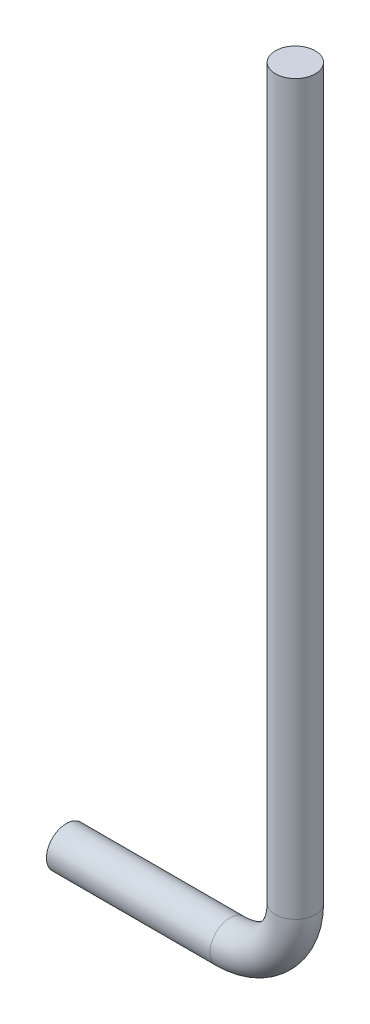
ISO-10303-21;
HEADER;
FILE_DESCRIPTION(('STEP AP214'),'2;1');
FILE_NAME('part.step','',(''),(''),'','','');
FILE_SCHEMA(('AUTOMOTIVE_DESIGN { 1 0 10303 214 1 1 1 1 }'));
ENDSEC;
DATA;
#1=APPLICATION_CONTEXT('core data for automotive mechanical design processes');
#2=APPLICATION_PROTOCOL_DEFINITION('international standard','automotive_design',2000,#1);
#3=PRODUCT_CONTEXT('',#1,'mechanical');
#4=PRODUCT('Part','Part','',(#3));
#5=PRODUCT_RELATED_PRODUCT_CATEGORY('part','',(#4));
#6=PRODUCT_DEFINITION_FORMATION('','',#4);
#7=PRODUCT_DEFINITION_CONTEXT('part definition',#1,'design');
#8=PRODUCT_DEFINITION('design','',#6,#7);
#9=PRODUCT_DEFINITION_SHAPE('','',#8);
#10=(LENGTH_UNIT() NAMED_UNIT(*) SI_UNIT(.MILLI.,.METRE.));
#11=(NAMED_UNIT(*) PLANE_ANGLE_UNIT() SI_UNIT($,.RADIAN.));
#12=(NAMED_UNIT(*) SI_UNIT($,.STERADIAN.) SOLID_ANGLE_UNIT());
#13=UNCERTAINTY_MEASURE_WITH_UNIT(LENGTH_MEASURE(1.E-05),#10,'distance_accuracy_value','');
#14=(GEOMETRIC_REPRESENTATION_CONTEXT(3) GLOBAL_UNCERTAINTY_ASSIGNED_CONTEXT((#13)) GLOBAL_UNIT_ASSIGNED_CONTEXT((#10,
#11,#12)) REPRESENTATION_CONTEXT('',''));
#15=CARTESIAN_POINT('',(0.,0.,0.));
#16=DIRECTION('',(0.,0.,1.));
#17=DIRECTION('',(1.,0.,0.));
#18=AXIS2_PLACEMENT_3D('',#15,#16,#17);
#19=CARTESIAN_POINT('',(25.,-23.,-5.));
#20=DIRECTION('',(-1.,0.,0.));
#21=DIRECTION('',(0.,-1.,0.));
#22=AXIS2_PLACEMENT_3D('',#19,#20,#21);
#23=CYLINDRICAL_SURFACE('',#22,3.05);
#24=CARTESIAN_POINT('',(25.,-23.,-5.));
#25=DIRECTION('',(1.,0.,0.));
#26=DIRECTION('',(0.,0.,1.));
#27=AXIS2_PLACEMENT_3D('',#24,#25,#26);
#28=CIRCLE('',#27,3.05);
#29=CARTESIAN_POINT('',(25.,-26.05,-5.));
#30=VERTEX_POINT('',#29);
#31=EDGE_CURVE('E40',#30,#30,#28,.T.);
#32=ORIENTED_EDGE('',*,*,#31,.F.);
#33=EDGE_LOOP('',(#32));
#34=FACE_BOUND('',#33,.T.);
#35=CARTESIAN_POINT('',(0.,-23.,-5.));
#36=DIRECTION('',(1.,0.,0.));
#37=DIRECTION('',(0.,0.,1.));
#38=AXIS2_PLACEMENT_3D('',#35,#36,#37);
#39=CIRCLE('',#38,3.05);
#40=CARTESIAN_POINT('',(0.,-23.,-1.95));
#41=VERTEX_POINT('',#40);
#42=EDGE_CURVE('E10',#41,#41,#39,.T.);
#43=ORIENTED_EDGE('',*,*,#42,.T.);
#44=EDGE_LOOP('',(#43));
#45=FACE_BOUND('',#44,.T.);
#46=ADVANCED_FACE('F34',(#34,#45),#23,.T.);
#47=CARTESIAN_POINT('',(25.,-13.,-5.));
#48=DIRECTION('',(0.,0.,-1.));
#49=DIRECTION('',(-1.,0.,0.));
#50=AXIS2_PLACEMENT_3D('',#47,#48,#49);
#51=TOROIDAL_SURFACE('',#50,10.,3.05);
#52=CARTESIAN_POINT('',(35.,-13.,-5.));
#53=DIRECTION('',(0.,1.,0.));
#54=DIRECTION('',(0.,0.,1.));
#55=AXIS2_PLACEMENT_3D('',#52,#53,#54);
#56=CIRCLE('',#55,3.05);
#57=CARTESIAN_POINT('',(38.05,-13.,-5.));
#58=VERTEX_POINT('',#57);
#59=EDGE_CURVE('E44',#58,#58,#56,.T.);
#60=CARTESIAN_POINT('',(25.,-13.,-5.));
#61=DIRECTION('',(0.,0.,-1.));
#62=DIRECTION('',(-1.,0.,0.));
#63=AXIS2_PLACEMENT_3D('',#60,#61,#62);
#64=CIRCLE('',#63,13.05);
#65=EDGE_CURVE('',#58,#30,#64,.T.);
#66=ORIENTED_EDGE('',*,*,#59,.F.);
#67=ORIENTED_EDGE('',*,*,#31,.T.);
#68=ORIENTED_EDGE('',*,*,#65,.T.);
#69=ORIENTED_EDGE('',*,*,#65,.F.);
#70=EDGE_LOOP('',(#66,#68,#67,#69));
#71=FACE_BOUND('',#70,.T.);
#72=ADVANCED_FACE('F59',(#71),#51,.T.);
#73=CARTESIAN_POINT('',(35.,-13.,-5.));
#74=DIRECTION('',(0.,1.,0.));
#75=DIRECTION('',(0.,0.,1.));
#76=AXIS2_PLACEMENT_3D('',#73,#74,#75);
#77=CYLINDRICAL_SURFACE('',#76,3.05);
#78=ORIENTED_EDGE('',*,*,#59,.T.);
#79=EDGE_LOOP('',(#78));
#80=FACE_BOUND('',#79,.T.);
#81=CARTESIAN_POINT('',(35.,98.3,-5.));
#82=DIRECTION('',(0.,1.,0.));
#83=DIRECTION('',(0.,0.,1.));
#84=AXIS2_PLACEMENT_3D('',#81,#82,#83);
#85=CIRCLE('',#84,3.05);
#86=CARTESIAN_POINT('',(35.,98.3,-1.95));
#87=VERTEX_POINT('',#86);
#88=EDGE_CURVE('E48',#87,#87,#85,.T.);
#89=ORIENTED_EDGE('',*,*,#88,.F.);
#90=EDGE_LOOP('',(#89));
#91=FACE_BOUND('',#90,.T.);
#92=ADVANCED_FACE('F56',(#80,#91),#77,.T.);
#93=CARTESIAN_POINT('',(0.,-23.,-5.));
#94=DIRECTION('',(1.,0.,0.));
#95=DIRECTION('',(0.,0.,1.));
#96=AXIS2_PLACEMENT_3D('',#93,#94,#95);
#97=PLANE('',#96);
#98=ORIENTED_EDGE('',*,*,#42,.F.);
#99=EDGE_LOOP('',(#98));
#100=FACE_BOUND('',#99,.T.);
#101=ADVANCED_FACE('F58',(#100),#97,.F.);
#102=CARTESIAN_POINT('',(35.,98.3,-5.));
#103=DIRECTION('',(0.,1.,0.));
#104=DIRECTION('',(0.,0.,1.));
#105=AXIS2_PLACEMENT_3D('',#102,#103,#104);
#106=PLANE('',#105);
#107=ORIENTED_EDGE('',*,*,#88,.T.);
#108=EDGE_LOOP('',(#107));
#109=FACE_BOUND('',#108,.T.);
#110=ADVANCED_FACE('F54',(#109),#106,.T.);
#111=CLOSED_SHELL('',(#46,#72,#92,#101,#110));
#112=MANIFOLD_SOLID_BREP('B2',#111);
#113=ADVANCED_BREP_SHAPE_REPRESENTATION('',(#18,#112),#14);
#114=SHAPE_DEFINITION_REPRESENTATION(#9,#113);
ENDSEC;
END-ISO-10303-21;
